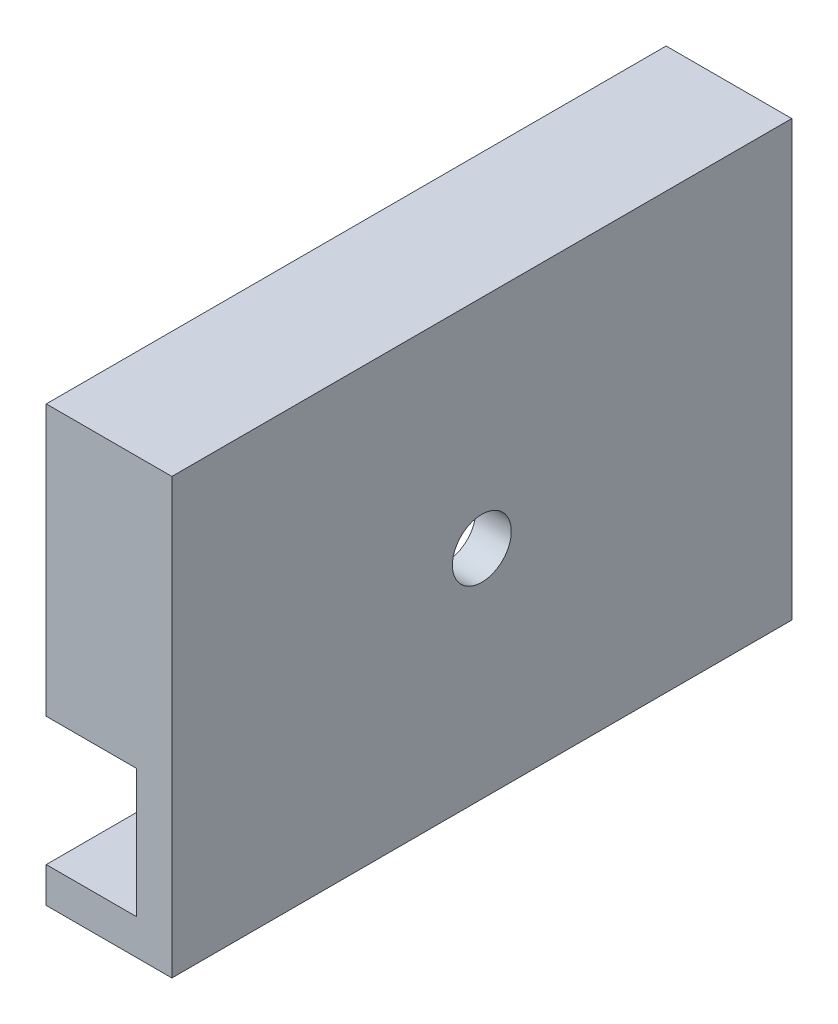
ISO-10303-21;
HEADER;
FILE_DESCRIPTION(('STEP AP214'),'2;1');
FILE_NAME('part.step','',(''),(''),'','','');
FILE_SCHEMA(('AUTOMOTIVE_DESIGN { 1 0 10303 214 1 1 1 1 }'));
ENDSEC;
DATA;
#1=APPLICATION_CONTEXT('core data for automotive mechanical design processes');
#2=APPLICATION_PROTOCOL_DEFINITION('international standard','automotive_design',2000,#1);
#3=PRODUCT_CONTEXT('',#1,'mechanical');
#4=PRODUCT('Part','Part','',(#3));
#5=PRODUCT_RELATED_PRODUCT_CATEGORY('part','',(#4));
#6=PRODUCT_DEFINITION_FORMATION('','',#4);
#7=PRODUCT_DEFINITION_CONTEXT('part definition',#1,'design');
#8=PRODUCT_DEFINITION('design','',#6,#7);
#9=PRODUCT_DEFINITION_SHAPE('','',#8);
#10=(LENGTH_UNIT() NAMED_UNIT(*) SI_UNIT(.MILLI.,.METRE.));
#11=(NAMED_UNIT(*) PLANE_ANGLE_UNIT() SI_UNIT($,.RADIAN.));
#12=(NAMED_UNIT(*) SI_UNIT($,.STERADIAN.) SOLID_ANGLE_UNIT());
#13=UNCERTAINTY_MEASURE_WITH_UNIT(LENGTH_MEASURE(1.E-05),#10,'distance_accuracy_value','');
#14=(GEOMETRIC_REPRESENTATION_CONTEXT(3) GLOBAL_UNCERTAINTY_ASSIGNED_CONTEXT((#13)) GLOBAL_UNIT_ASSIGNED_CONTEXT((#10,
#11,#12)) REPRESENTATION_CONTEXT('',''));
#15=CARTESIAN_POINT('',(0.,0.,0.));
#16=DIRECTION('',(0.,0.,1.));
#17=DIRECTION('',(1.,0.,0.));
#18=AXIS2_PLACEMENT_3D('',#15,#16,#17);
#19=CARTESIAN_POINT('',(6.468999,26.06675,88.9));
#20=DIRECTION('',(0.,1.,0.));
#21=DIRECTION('',(-1.,0.,0.));
#22=AXIS2_PLACEMENT_3D('',#19,#20,#21);
#23=PLANE('',#22);
#24=DIRECTION('',(1.,0.,0.));
#25=VECTOR('',#24,1.);
#26=CARTESIAN_POINT('',(6.468999,26.06675,83.82));
#27=LINE('',#26,#25);
#28=CARTESIAN_POINT('',(-6.468999,26.06675,83.82));
#29=VERTEX_POINT('',#28);
#30=CARTESIAN_POINT('',(6.468999,26.06675,83.82));
#31=VERTEX_POINT('',#30);
#32=EDGE_CURVE('E159',#29,#31,#27,.T.);
#33=ORIENTED_EDGE('',*,*,#32,.F.);
#34=DIRECTION('',(0.,0.,-1.));
#35=VECTOR('',#34,1.);
#36=CARTESIAN_POINT('',(-6.468999,26.06675,88.9));
#37=LINE('',#36,#35);
#38=CARTESIAN_POINT('',(-6.468999,26.06675,0.));
#39=VERTEX_POINT('',#38);
#40=EDGE_CURVE('E207',#29,#39,#37,.T.);
#41=ORIENTED_EDGE('',*,*,#40,.T.);
#42=DIRECTION('',(1.,0.,0.));
#43=VECTOR('',#42,1.);
#44=CARTESIAN_POINT('',(6.468999,26.06675,0.));
#45=LINE('',#44,#43);
#46=CARTESIAN_POINT('',(6.468999,26.06675,0.));
#47=VERTEX_POINT('',#46);
#48=EDGE_CURVE('E200',#39,#47,#45,.T.);
#49=ORIENTED_EDGE('',*,*,#48,.T.);
#50=DIRECTION('',(0.,0.,-1.));
#51=VECTOR('',#50,1.);
#52=CARTESIAN_POINT('',(6.468999,26.06675,88.9));
#53=LINE('',#52,#51);
#54=EDGE_CURVE('E205',#31,#47,#53,.T.);
#55=ORIENTED_EDGE('',*,*,#54,.F.);
#56=EDGE_LOOP('',(#33,#41,#49,#55));
#57=FACE_BOUND('',#56,.T.);
#58=ADVANCED_FACE('F32',(#57),#23,.F.);
#59=CARTESIAN_POINT('',(6.468999,-26.06675,88.9));
#60=DIRECTION('',(0.,-1.,0.));
#61=DIRECTION('',(1.,0.,0.));
#62=AXIS2_PLACEMENT_3D('',#59,#60,#61);
#63=PLANE('',#62);
#64=DIRECTION('',(0.,0.,-1.));
#65=VECTOR('',#64,1.);
#66=CARTESIAN_POINT('',(6.468999,-26.06675,88.9));
#67=LINE('',#66,#65);
#68=CARTESIAN_POINT('',(6.468999,-26.06675,88.9));
#69=VERTEX_POINT('',#68);
#70=CARTESIAN_POINT('',(6.468999,-26.06675,5.08));
#71=VERTEX_POINT('',#70);
#72=EDGE_CURVE('E186',#69,#71,#67,.T.);
#73=ORIENTED_EDGE('',*,*,#72,.T.);
#74=DIRECTION('',(-1.,0.,0.));
#75=VECTOR('',#74,1.);
#76=CARTESIAN_POINT('',(6.468999,-26.06675,5.08));
#77=LINE('',#76,#75);
#78=CARTESIAN_POINT('',(-6.468999,-26.06675,5.08));
#79=VERTEX_POINT('',#78);
#80=EDGE_CURVE('E47',#71,#79,#77,.T.);
#81=ORIENTED_EDGE('',*,*,#80,.T.);
#82=DIRECTION('',(0.,0.,-1.));
#83=VECTOR('',#82,1.);
#84=CARTESIAN_POINT('',(-6.468999,-26.06675,88.9));
#85=LINE('',#84,#83);
#86=CARTESIAN_POINT('',(-6.468999,-26.06675,88.9));
#87=VERTEX_POINT('',#86);
#88=EDGE_CURVE('E129',#87,#79,#85,.T.);
#89=ORIENTED_EDGE('',*,*,#88,.F.);
#90=DIRECTION('',(-1.,0.,0.));
#91=VECTOR('',#90,1.);
#92=CARTESIAN_POINT('',(6.468999,-26.06675,88.9));
#93=LINE('',#92,#91);
#94=EDGE_CURVE('E168',#69,#87,#93,.T.);
#95=ORIENTED_EDGE('',*,*,#94,.F.);
#96=EDGE_LOOP('',(#73,#81,#89,#95));
#97=FACE_BOUND('',#96,.T.);
#98=ADVANCED_FACE('F34',(#97),#63,.F.);
#99=CARTESIAN_POINT('',(-6.468999,-31.14675,88.9));
#100=DIRECTION('',(-1.,0.,0.));
#101=DIRECTION('',(0.,-1.,0.));
#102=AXIS2_PLACEMENT_3D('',#99,#100,#101);
#103=PLANE('',#102);
#104=ORIENTED_EDGE('',*,*,#88,.T.);
#105=DIRECTION('',(0.,1.,0.));
#106=VECTOR('',#105,1.);
#107=CARTESIAN_POINT('',(-6.468999,-31.14675,5.08));
#108=LINE('',#107,#106);
#109=CARTESIAN_POINT('',(-6.468999,7.65175000000001,5.08));
#110=VERTEX_POINT('',#109);
#111=EDGE_CURVE('E122',#79,#110,#108,.T.);
#112=ORIENTED_EDGE('',*,*,#111,.T.);
#113=DIRECTION('',(0.,0.,-1.));
#114=VECTOR('',#113,1.);
#115=CARTESIAN_POINT('',(-6.468999,7.65175000000001,5.08));
#116=LINE('',#115,#114);
#117=CARTESIAN_POINT('',(-6.468999,7.65175000000001,0.));
#118=VERTEX_POINT('',#117);
#119=EDGE_CURVE('E126',#110,#118,#116,.T.);
#120=ORIENTED_EDGE('',*,*,#119,.T.);
#121=DIRECTION('',(0.,1.,0.));
#122=VECTOR('',#121,1.);
#123=CARTESIAN_POINT('',(-6.468999,-31.14675,0.));
#124=LINE('',#123,#122);
#125=CARTESIAN_POINT('',(-6.468999,-31.14675,0.));
#126=VERTEX_POINT('',#125);
#127=EDGE_CURVE('E167',#126,#118,#124,.T.);
#128=ORIENTED_EDGE('',*,*,#127,.F.);
#129=DIRECTION('',(0.,0.,-1.));
#130=VECTOR('',#129,1.);
#131=CARTESIAN_POINT('',(-6.468999,-31.14675,88.9));
#132=LINE('',#131,#130);
#133=CARTESIAN_POINT('',(-6.468999,-31.14675,88.9));
#134=VERTEX_POINT('',#133);
#135=EDGE_CURVE('E215',#134,#126,#132,.T.);
#136=ORIENTED_EDGE('',*,*,#135,.F.);
#137=DIRECTION('',(0.,1.,0.));
#138=VECTOR('',#137,1.);
#139=CARTESIAN_POINT('',(-6.468999,-31.14675,88.9));
#140=LINE('',#139,#138);
#141=EDGE_CURVE('E170',#134,#87,#140,.T.);
#142=ORIENTED_EDGE('',*,*,#141,.T.);
#143=EDGE_LOOP('',(#104,#112,#120,#128,#136,#142));
#144=FACE_BOUND('',#143,.T.);
#145=ADVANCED_FACE('F124',(#144),#103,.T.);
#146=CARTESIAN_POINT('',(6.468999,-31.14675,88.9));
#147=DIRECTION('',(0.,-1.,0.));
#148=DIRECTION('',(1.,0.,0.));
#149=AXIS2_PLACEMENT_3D('',#146,#147,#148);
#150=PLANE('',#149);
#151=ORIENTED_EDGE('',*,*,#135,.T.);
#152=DIRECTION('',(-1.,0.,0.));
#153=VECTOR('',#152,1.);
#154=CARTESIAN_POINT('',(6.468999,-31.14675,0.));
#155=LINE('',#154,#153);
#156=CARTESIAN_POINT('',(11.548999,-31.14675,0.));
#157=VERTEX_POINT('',#156);
#158=EDGE_CURVE('E188',#157,#126,#155,.T.);
#159=ORIENTED_EDGE('',*,*,#158,.F.);
#160=DIRECTION('',(0.,0.,-1.));
#161=VECTOR('',#160,1.);
#162=CARTESIAN_POINT('',(11.548999,-31.14675,88.9));
#163=LINE('',#162,#161);
#164=CARTESIAN_POINT('',(11.548999,-31.14675,88.9));
#165=VERTEX_POINT('',#164);
#166=EDGE_CURVE('E213',#165,#157,#163,.T.);
#167=ORIENTED_EDGE('',*,*,#166,.F.);
#168=DIRECTION('',(-1.,0.,0.));
#169=VECTOR('',#168,1.);
#170=CARTESIAN_POINT('',(6.468999,-31.14675,88.9));
#171=LINE('',#170,#169);
#172=EDGE_CURVE('E173',#165,#134,#171,.T.);
#173=ORIENTED_EDGE('',*,*,#172,.T.);
#174=EDGE_LOOP('',(#151,#159,#167,#173));
#175=FACE_BOUND('',#174,.T.);
#176=ADVANCED_FACE('F250',(#175),#150,.T.);
#177=CARTESIAN_POINT('',(11.548999,-26.06675,88.9));
#178=DIRECTION('',(1.,0.,0.));
#179=DIRECTION('',(0.,0.,-1.));
#180=AXIS2_PLACEMENT_3D('',#177,#178,#179);
#181=PLANE('',#180);
#182=ORIENTED_EDGE('',*,*,#166,.T.);
#183=DIRECTION('',(0.,1.,0.));
#184=VECTOR('',#183,1.);
#185=CARTESIAN_POINT('',(11.548999,-26.06675,0.));
#186=LINE('',#185,#184);
#187=CARTESIAN_POINT('',(11.548999,31.14675,0.));
#188=VERTEX_POINT('',#187);
#189=EDGE_CURVE('E191',#188,#157,#186,.F.);
#190=ORIENTED_EDGE('',*,*,#189,.F.);
#191=DIRECTION('',(0.,0.,-1.));
#192=VECTOR('',#191,1.);
#193=CARTESIAN_POINT('',(11.548999,31.14675,88.9));
#194=LINE('',#193,#192);
#195=CARTESIAN_POINT('',(11.548999,31.14675,88.9));
#196=VERTEX_POINT('',#195);
#197=EDGE_CURVE('E211',#196,#188,#194,.T.);
#198=ORIENTED_EDGE('',*,*,#197,.F.);
#199=DIRECTION('',(0.,1.,0.));
#200=VECTOR('',#199,1.);
#201=CARTESIAN_POINT('',(11.548999,-26.06675,88.9));
#202=LINE('',#201,#200);
#203=EDGE_CURVE('E176',#196,#165,#202,.F.);
#204=ORIENTED_EDGE('',*,*,#203,.T.);
#205=EDGE_LOOP('',(#182,#190,#198,#204));
#206=FACE_BOUND('',#205,.T.);
#207=CARTESIAN_POINT('',(11.548999,0.,44.45));
#208=DIRECTION('',(1.,0.,0.));
#209=DIRECTION('',(0.,0.,-1.));
#210=AXIS2_PLACEMENT_3D('',#207,#208,#209);
#211=CIRCLE('',#210,4.22275);
#212=CARTESIAN_POINT('',(11.548999,0.,48.67275));
#213=VERTEX_POINT('',#212);
#214=EDGE_CURVE('E164',#213,#213,#211,.F.);
#215=ORIENTED_EDGE('',*,*,#214,.T.);
#216=EDGE_LOOP('',(#215));
#217=FACE_BOUND('',#216,.T.);
#218=ADVANCED_FACE('F253',(#206,#217),#181,.T.);
#219=CARTESIAN_POINT('',(6.468999,31.14675,88.9));
#220=DIRECTION('',(0.,1.,0.));
#221=DIRECTION('',(-1.,0.,0.));
#222=AXIS2_PLACEMENT_3D('',#219,#220,#221);
#223=PLANE('',#222);
#224=ORIENTED_EDGE('',*,*,#197,.T.);
#225=DIRECTION('',(1.,0.,0.));
#226=VECTOR('',#225,1.);
#227=CARTESIAN_POINT('',(6.468999,31.14675,0.));
#228=LINE('',#227,#226);
#229=CARTESIAN_POINT('',(-6.468999,31.14675,0.));
#230=VERTEX_POINT('',#229);
#231=EDGE_CURVE('E194',#230,#188,#228,.T.);
#232=ORIENTED_EDGE('',*,*,#231,.F.);
#233=DIRECTION('',(0.,0.,-1.));
#234=VECTOR('',#233,1.);
#235=CARTESIAN_POINT('',(-6.468999,31.14675,88.9));
#236=LINE('',#235,#234);
#237=CARTESIAN_POINT('',(-6.468999,31.14675,88.9));
#238=VERTEX_POINT('',#237);
#239=EDGE_CURVE('E209',#238,#230,#236,.T.);
#240=ORIENTED_EDGE('',*,*,#239,.F.);
#241=DIRECTION('',(1.,0.,0.));
#242=VECTOR('',#241,1.);
#243=CARTESIAN_POINT('',(6.468999,31.14675,88.9));
#244=LINE('',#243,#242);
#245=EDGE_CURVE('E178',#238,#196,#244,.T.);
#246=ORIENTED_EDGE('',*,*,#245,.T.);
#247=EDGE_LOOP('',(#224,#232,#240,#246));
#248=FACE_BOUND('',#247,.T.);
#249=ADVANCED_FACE('F257',(#248),#223,.T.);
#250=CARTESIAN_POINT('',(-6.468999,26.06675,88.9));
#251=DIRECTION('',(-1.,0.,0.));
#252=DIRECTION('',(0.,-1.,0.));
#253=AXIS2_PLACEMENT_3D('',#250,#251,#252);
#254=PLANE('',#253);
#255=ORIENTED_EDGE('',*,*,#239,.T.);
#256=DIRECTION('',(0.,1.,0.));
#257=VECTOR('',#256,1.);
#258=CARTESIAN_POINT('',(-6.468999,26.06675,0.));
#259=LINE('',#258,#257);
#260=EDGE_CURVE('E197',#39,#230,#259,.T.);
#261=ORIENTED_EDGE('',*,*,#260,.F.);
#262=ORIENTED_EDGE('',*,*,#40,.F.);
#263=DIRECTION('',(0.,-1.,0.));
#264=VECTOR('',#263,1.);
#265=CARTESIAN_POINT('',(-6.468999,31.14675,83.82));
#266=LINE('',#265,#264);
#267=CARTESIAN_POINT('',(-6.468999,-7.65175,83.82));
#268=VERTEX_POINT('',#267);
#269=EDGE_CURVE('E147',#29,#268,#266,.T.);
#270=ORIENTED_EDGE('',*,*,#269,.T.);
#271=DIRECTION('',(0.,0.,1.));
#272=VECTOR('',#271,1.);
#273=CARTESIAN_POINT('',(-6.468999,-7.65175,83.82));
#274=LINE('',#273,#272);
#275=CARTESIAN_POINT('',(-6.468999,-7.65175,88.9));
#276=VERTEX_POINT('',#275);
#277=EDGE_CURVE('E152',#268,#276,#274,.T.);
#278=ORIENTED_EDGE('',*,*,#277,.T.);
#279=DIRECTION('',(0.,1.,0.));
#280=VECTOR('',#279,1.);
#281=CARTESIAN_POINT('',(-6.468999,26.06675,88.9));
#282=LINE('',#281,#280);
#283=EDGE_CURVE('E181',#276,#238,#282,.T.);
#284=ORIENTED_EDGE('',*,*,#283,.T.);
#285=EDGE_LOOP('',(#255,#261,#262,#270,#278,#284));
#286=FACE_BOUND('',#285,.T.);
#287=ADVANCED_FACE('F239',(#286),#254,.T.);
#288=CARTESIAN_POINT('',(6.468999,-26.06675,88.9));
#289=DIRECTION('',(1.,0.,0.));
#290=DIRECTION('',(0.,0.,-1.));
#291=AXIS2_PLACEMENT_3D('',#288,#289,#290);
#292=PLANE('',#291);
#293=CARTESIAN_POINT('',(6.468999,0.,44.45));
#294=DIRECTION('',(-1.,0.,0.));
#295=DIRECTION('',(0.,0.,1.));
#296=AXIS2_PLACEMENT_3D('',#293,#294,#295);
#297=CIRCLE('',#296,4.22275);
#298=CARTESIAN_POINT('',(6.468999,0.,48.67275));
#299=VERTEX_POINT('',#298);
#300=EDGE_CURVE('E161',#299,#299,#297,.T.);
#301=ORIENTED_EDGE('',*,*,#300,.F.);
#302=EDGE_LOOP('',(#301));
#303=FACE_BOUND('',#302,.T.);
#304=DIRECTION('',(0.,-1.,0.));
#305=VECTOR('',#304,1.);
#306=CARTESIAN_POINT('',(6.468999,-26.06675,0.));
#307=LINE('',#306,#305);
#308=CARTESIAN_POINT('',(6.468999,7.65175000000001,0.));
#309=VERTEX_POINT('',#308);
#310=EDGE_CURVE('E171',#47,#309,#307,.T.);
#311=ORIENTED_EDGE('',*,*,#310,.T.);
#312=DIRECTION('',(0.,0.,1.));
#313=VECTOR('',#312,1.);
#314=CARTESIAN_POINT('',(6.468999,7.65175000000001,88.9));
#315=LINE('',#314,#313);
#316=CARTESIAN_POINT('',(6.468999,7.65175000000001,5.08));
#317=VERTEX_POINT('',#316);
#318=EDGE_CURVE('E54',#309,#317,#315,.T.);
#319=ORIENTED_EDGE('',*,*,#318,.T.);
#320=DIRECTION('',(0.,-1.,0.));
#321=VECTOR('',#320,1.);
#322=CARTESIAN_POINT('',(6.468999,-26.06675,5.08));
#323=LINE('',#322,#321);
#324=EDGE_CURVE('E12',#317,#71,#323,.T.);
#325=ORIENTED_EDGE('',*,*,#324,.T.);
#326=ORIENTED_EDGE('',*,*,#72,.F.);
#327=DIRECTION('',(0.,-1.,0.));
#328=VECTOR('',#327,1.);
#329=CARTESIAN_POINT('',(6.468999,-26.06675,88.9));
#330=LINE('',#329,#328);
#331=CARTESIAN_POINT('',(6.468999,-7.65175000000001,88.9));
#332=VERTEX_POINT('',#331);
#333=EDGE_CURVE('E184',#332,#69,#330,.T.);
#334=ORIENTED_EDGE('',*,*,#333,.F.);
#335=DIRECTION('',(0.,0.,-1.));
#336=VECTOR('',#335,1.);
#337=CARTESIAN_POINT('',(6.468999,-7.65175000000001,88.9));
#338=LINE('',#337,#336);
#339=CARTESIAN_POINT('',(6.468999,-7.65175000000001,83.82));
#340=VERTEX_POINT('',#339);
#341=EDGE_CURVE('E156',#332,#340,#338,.T.);
#342=ORIENTED_EDGE('',*,*,#341,.T.);
#343=DIRECTION('',(0.,-1.,0.));
#344=VECTOR('',#343,1.);
#345=CARTESIAN_POINT('',(6.468999,-26.06675,83.82));
#346=LINE('',#345,#344);
#347=EDGE_CURVE('E40',#31,#340,#346,.T.);
#348=ORIENTED_EDGE('',*,*,#347,.F.);
#349=ORIENTED_EDGE('',*,*,#54,.T.);
#350=EDGE_LOOP('',(#311,#319,#325,#326,#334,#342,#348,#349));
#351=FACE_BOUND('',#350,.T.);
#352=ADVANCED_FACE('F229',(#303,#351),#292,.F.);
#353=CARTESIAN_POINT('',(-6.468999,-26.06675,88.9));
#354=DIRECTION('',(0.,0.,-1.));
#355=DIRECTION('',(-1.,0.,0.));
#356=AXIS2_PLACEMENT_3D('',#353,#354,#355);
#357=PLANE('',#356);
#358=ORIENTED_EDGE('',*,*,#172,.F.);
#359=ORIENTED_EDGE('',*,*,#203,.F.);
#360=ORIENTED_EDGE('',*,*,#245,.F.);
#361=ORIENTED_EDGE('',*,*,#283,.F.);
#362=DIRECTION('',(1.,0.,0.));
#363=VECTOR('',#362,1.);
#364=CARTESIAN_POINT('',(-6.468999,-7.65175,88.9));
#365=LINE('',#364,#363);
#366=EDGE_CURVE('E146',#276,#332,#365,.T.);
#367=ORIENTED_EDGE('',*,*,#366,.T.);
#368=ORIENTED_EDGE('',*,*,#333,.T.);
#369=ORIENTED_EDGE('',*,*,#94,.T.);
#370=ORIENTED_EDGE('',*,*,#141,.F.);
#371=EDGE_LOOP('',(#358,#359,#360,#361,#367,#368,#369,#370));
#372=FACE_BOUND('',#371,.T.);
#373=ADVANCED_FACE('F234',(#372),#357,.F.);
#374=CARTESIAN_POINT('',(-6.468999,-26.06675,0.));
#375=DIRECTION('',(0.,0.,-1.));
#376=DIRECTION('',(-1.,0.,0.));
#377=AXIS2_PLACEMENT_3D('',#374,#375,#376);
#378=PLANE('',#377);
#379=ORIENTED_EDGE('',*,*,#127,.T.);
#380=DIRECTION('',(1.,0.,0.));
#381=VECTOR('',#380,1.);
#382=CARTESIAN_POINT('',(11.548999,7.65175000000001,0.));
#383=LINE('',#382,#381);
#384=EDGE_CURVE('E133',#118,#309,#383,.T.);
#385=ORIENTED_EDGE('',*,*,#384,.T.);
#386=ORIENTED_EDGE('',*,*,#310,.F.);
#387=ORIENTED_EDGE('',*,*,#48,.F.);
#388=ORIENTED_EDGE('',*,*,#260,.T.);
#389=ORIENTED_EDGE('',*,*,#231,.T.);
#390=ORIENTED_EDGE('',*,*,#189,.T.);
#391=ORIENTED_EDGE('',*,*,#158,.T.);
#392=EDGE_LOOP('',(#379,#385,#386,#387,#388,#389,#390,#391));
#393=FACE_BOUND('',#392,.T.);
#394=ADVANCED_FACE('F246',(#393),#378,.T.);
#395=CARTESIAN_POINT('',(23.492739641022,0.,44.45));
#396=DIRECTION('',(-1.,0.,0.));
#397=DIRECTION('',(0.,0.,1.));
#398=AXIS2_PLACEMENT_3D('',#395,#396,#397);
#399=CYLINDRICAL_SURFACE('',#398,4.22275);
#400=CARTESIAN_POINT('',(6.468999,0.,48.67275));
#401=CARTESIAN_POINT('',(6.52191566666667,0.,48.67275));
#402=CARTESIAN_POINT('',(6.57483233333334,0.,48.67275));
#403=CARTESIAN_POINT('',(6.68066566666667,0.,48.67275));
#404=CARTESIAN_POINT('',(6.73358233333334,0.,48.67275));
#405=CARTESIAN_POINT('',(6.83941566666667,0.,48.67275));
#406=CARTESIAN_POINT('',(6.89233233333334,0.,48.67275));
#407=CARTESIAN_POINT('',(6.99816566666667,0.,48.67275));
#408=CARTESIAN_POINT('',(7.05108233333334,0.,48.67275));
#409=CARTESIAN_POINT('',(7.15691566666667,0.,48.67275));
#410=CARTESIAN_POINT('',(7.20983233333334,0.,48.67275));
#411=CARTESIAN_POINT('',(7.31566566666667,0.,48.67275));
#412=CARTESIAN_POINT('',(7.36858233333334,0.,48.67275));
#413=CARTESIAN_POINT('',(7.47441566666667,0.,48.67275));
#414=CARTESIAN_POINT('',(7.52733233333334,0.,48.67275));
#415=CARTESIAN_POINT('',(7.63316566666667,0.,48.67275));
#416=CARTESIAN_POINT('',(7.68608233333334,0.,48.67275));
#417=CARTESIAN_POINT('',(7.79191566666667,0.,48.67275));
#418=CARTESIAN_POINT('',(7.84483233333333,0.,48.67275));
#419=CARTESIAN_POINT('',(7.95066566666667,0.,48.67275));
#420=CARTESIAN_POINT('',(8.00358233333333,0.,48.67275));
#421=CARTESIAN_POINT('',(8.10941566666667,0.,48.67275));
#422=CARTESIAN_POINT('',(8.16233233333334,0.,48.67275));
#423=CARTESIAN_POINT('',(8.26816566666667,0.,48.67275));
#424=CARTESIAN_POINT('',(8.32108233333333,0.,48.67275));
#425=CARTESIAN_POINT('',(8.42691566666667,0.,48.67275));
#426=CARTESIAN_POINT('',(8.47983233333333,0.,48.67275));
#427=CARTESIAN_POINT('',(8.58566566666667,0.,48.67275));
#428=CARTESIAN_POINT('',(8.63858233333333,0.,48.67275));
#429=CARTESIAN_POINT('',(8.74441566666667,0.,48.67275));
#430=CARTESIAN_POINT('',(8.79733233333333,0.,48.67275));
#431=CARTESIAN_POINT('',(8.90316566666667,0.,48.67275));
#432=CARTESIAN_POINT('',(8.95608233333333,0.,48.67275));
#433=CARTESIAN_POINT('',(9.06191566666667,0.,48.67275));
#434=CARTESIAN_POINT('',(9.11483233333333,0.,48.67275));
#435=CARTESIAN_POINT('',(9.22066566666667,0.,48.67275));
#436=CARTESIAN_POINT('',(9.27358233333333,0.,48.67275));
#437=CARTESIAN_POINT('',(9.37941566666667,0.,48.67275));
#438=CARTESIAN_POINT('',(9.43233233333333,0.,48.67275));
#439=CARTESIAN_POINT('',(9.53816566666667,0.,48.67275));
#440=CARTESIAN_POINT('',(9.59108233333333,0.,48.67275));
#441=CARTESIAN_POINT('',(9.69691566666667,0.,48.67275));
#442=CARTESIAN_POINT('',(9.74983233333333,0.,48.67275));
#443=CARTESIAN_POINT('',(9.85566566666667,0.,48.67275));
#444=CARTESIAN_POINT('',(9.90858233333333,0.,48.67275));
#445=CARTESIAN_POINT('',(10.0144156666667,0.,48.67275));
#446=CARTESIAN_POINT('',(10.0673323333333,0.,48.67275));
#447=CARTESIAN_POINT('',(10.1731656666667,0.,48.67275));
#448=CARTESIAN_POINT('',(10.2260823333333,0.,48.67275));
#449=CARTESIAN_POINT('',(10.3319156666667,0.,48.67275));
#450=CARTESIAN_POINT('',(10.3848323333333,0.,48.67275));
#451=CARTESIAN_POINT('',(10.4906656666667,0.,48.67275));
#452=CARTESIAN_POINT('',(10.5435823333333,0.,48.67275));
#453=CARTESIAN_POINT('',(10.6494156666667,0.,48.67275));
#454=CARTESIAN_POINT('',(10.7023323333333,0.,48.67275));
#455=CARTESIAN_POINT('',(10.8081656666667,0.,48.67275));
#456=CARTESIAN_POINT('',(10.8610823333333,0.,48.67275));
#457=CARTESIAN_POINT('',(10.9669156666667,0.,48.67275));
#458=CARTESIAN_POINT('',(11.0198323333333,0.,48.67275));
#459=CARTESIAN_POINT('',(11.1256656666667,0.,48.67275));
#460=CARTESIAN_POINT('',(11.1785823333333,0.,48.67275));
#461=CARTESIAN_POINT('',(11.2844156666667,0.,48.67275));
#462=CARTESIAN_POINT('',(11.3373323333333,0.,48.67275));
#463=CARTESIAN_POINT('',(11.4431656666667,0.,48.67275));
#464=CARTESIAN_POINT('',(11.4960823333333,0.,48.67275));
#465=CARTESIAN_POINT('',(11.548999,0.,48.67275));
#466=B_SPLINE_CURVE_WITH_KNOTS('',3,(#400,#401,#402,#403,#404,#405,#406,#407,#408,#409,#410,
#411,#412,#413,#414,#415,#416,#417,#418,#419,#420,#421,#422,#423,#424,#425,#426,#427,#428,#429,
#430,#431,#432,#433,#434,#435,#436,#437,#438,#439,#440,#441,#442,#443,#444,#445,#446,#447,#448,
#449,#450,#451,#452,#453,#454,#455,#456,#457,#458,#459,#460,#461,#462,#463,#464,#465),
.UNSPECIFIED.,.F.,.F.,(4,2,2,2,2,2,2,2,2,2,2,2,2,2,2,2,2,2,2,2,2,2,2,2,2,2,2,2,2,2,2,2,4),(0.,
0.158749999999999,0.317499999999998,0.476250000000001,0.635,0.793749999999999,0.952499999999998,
1.11125,1.27,1.42875,1.5875,1.74625,1.905,2.06375,2.2225,2.38125,2.54,2.69875,2.8575,3.01625,
3.175,3.33375,3.4925,3.65125,3.81,3.96875,4.1275,4.28625,4.445,4.60375,4.7625,4.92125,5.08),.UNSPECIFIED.);
#467=EDGE_CURVE('BSEAM277',#299,#213,#466,.T.);
#468=ORIENTED_EDGE('',*,*,#300,.T.);
#469=ORIENTED_EDGE('',*,*,#214,.F.);
#470=ORIENTED_EDGE('',*,*,#467,.T.);
#471=ORIENTED_EDGE('',*,*,#467,.F.);
#472=EDGE_LOOP('',(#468,#470,#469,#471));
#473=FACE_BOUND('',#472,.T.);
#474=ADVANCED_FACE('F277',(#473),#399,.F.);
#475=CARTESIAN_POINT('',(-6.468999,-7.65175,83.82));
#476=DIRECTION('',(0.,0.,1.));
#477=DIRECTION('',(1.,0.,0.));
#478=AXIS2_PLACEMENT_3D('',#475,#476,#477);
#479=PLANE('',#478);
#480=ORIENTED_EDGE('',*,*,#269,.F.);
#481=ORIENTED_EDGE('',*,*,#32,.T.);
#482=ORIENTED_EDGE('',*,*,#347,.T.);
#483=DIRECTION('',(1.,0.,0.));
#484=VECTOR('',#483,1.);
#485=CARTESIAN_POINT('',(-6.468999,-7.65175,83.82));
#486=LINE('',#485,#484);
#487=EDGE_CURVE('E149',#268,#340,#486,.T.);
#488=ORIENTED_EDGE('',*,*,#487,.F.);
#489=EDGE_LOOP('',(#480,#481,#482,#488));
#490=FACE_BOUND('',#489,.T.);
#491=ADVANCED_FACE('F220',(#490),#479,.F.);
#492=CARTESIAN_POINT('',(-6.468999,-7.65175,83.82));
#493=DIRECTION('',(0.,-1.,0.));
#494=DIRECTION('',(1.,0.,0.));
#495=AXIS2_PLACEMENT_3D('',#492,#493,#494);
#496=PLANE('',#495);
#497=ORIENTED_EDGE('',*,*,#341,.F.);
#498=ORIENTED_EDGE('',*,*,#366,.F.);
#499=ORIENTED_EDGE('',*,*,#277,.F.);
#500=ORIENTED_EDGE('',*,*,#487,.T.);
#501=EDGE_LOOP('',(#497,#498,#499,#500));
#502=FACE_BOUND('',#501,.T.);
#503=ADVANCED_FACE('F226',(#502),#496,.T.);
#504=CARTESIAN_POINT('',(11.548999,7.65175000000001,5.08));
#505=DIRECTION('',(0.,0.,1.));
#506=DIRECTION('',(1.,0.,0.));
#507=AXIS2_PLACEMENT_3D('',#504,#505,#506);
#508=PLANE('',#507);
#509=ORIENTED_EDGE('',*,*,#80,.F.);
#510=ORIENTED_EDGE('',*,*,#324,.F.);
#511=DIRECTION('',(1.,0.,0.));
#512=VECTOR('',#511,1.);
#513=CARTESIAN_POINT('',(11.548999,7.65175000000001,5.08));
#514=LINE('',#513,#512);
#515=EDGE_CURVE('E132',#110,#317,#514,.T.);
#516=ORIENTED_EDGE('',*,*,#515,.F.);
#517=ORIENTED_EDGE('',*,*,#111,.F.);
#518=EDGE_LOOP('',(#509,#510,#516,#517));
#519=FACE_BOUND('',#518,.T.);
#520=ADVANCED_FACE('F140',(#519),#508,.T.);
#521=CARTESIAN_POINT('',(11.548999,7.65175000000001,5.08));
#522=DIRECTION('',(0.,1.,0.));
#523=DIRECTION('',(0.,0.,1.));
#524=AXIS2_PLACEMENT_3D('',#521,#522,#523);
#525=PLANE('',#524);
#526=ORIENTED_EDGE('',*,*,#318,.F.);
#527=ORIENTED_EDGE('',*,*,#384,.F.);
#528=ORIENTED_EDGE('',*,*,#119,.F.);
#529=ORIENTED_EDGE('',*,*,#515,.T.);
#530=EDGE_LOOP('',(#526,#527,#528,#529));
#531=FACE_BOUND('',#530,.T.);
#532=ADVANCED_FACE('F137',(#531),#525,.T.);
#533=CLOSED_SHELL('',(#58,#98,#145,#176,#218,#249,#287,#352,#373,#394,#474,#491,#503,#520,#532));
#534=MANIFOLD_SOLID_BREP('B2',#533);
#535=ADVANCED_BREP_SHAPE_REPRESENTATION('',(#18,#534),#14);
#536=SHAPE_DEFINITION_REPRESENTATION(#9,#535);
ENDSEC;
END-ISO-10303-21;
